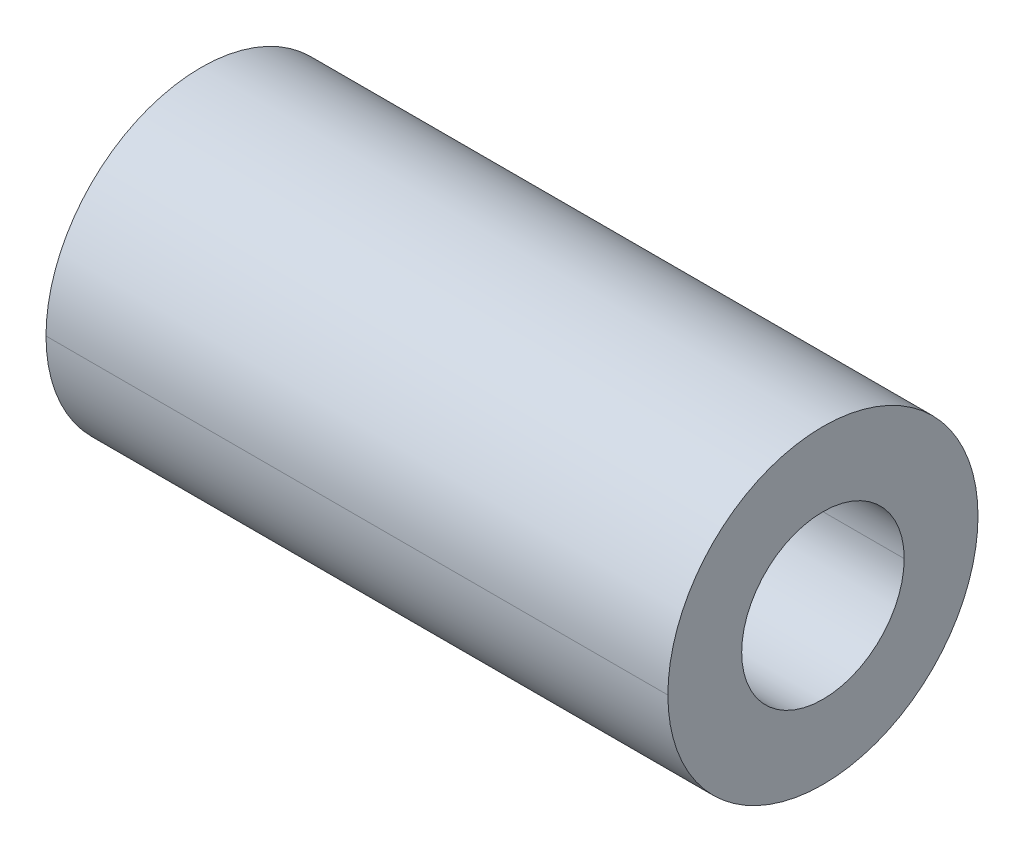
ISO-10303-21;
HEADER;
FILE_DESCRIPTION(('STEP AP214'),'2;1');
FILE_NAME('part.step','',(''),(''),'','','');
FILE_SCHEMA(('AUTOMOTIVE_DESIGN { 1 0 10303 214 1 1 1 1 }'));
ENDSEC;
DATA;
#1=APPLICATION_CONTEXT('core data for automotive mechanical design processes');
#2=APPLICATION_PROTOCOL_DEFINITION('international standard','automotive_design',2000,#1);
#3=PRODUCT_CONTEXT('',#1,'mechanical');
#4=PRODUCT('Part','Part','',(#3));
#5=PRODUCT_RELATED_PRODUCT_CATEGORY('part','',(#4));
#6=PRODUCT_DEFINITION_FORMATION('','',#4);
#7=PRODUCT_DEFINITION_CONTEXT('part definition',#1,'design');
#8=PRODUCT_DEFINITION('design','',#6,#7);
#9=PRODUCT_DEFINITION_SHAPE('','',#8);
#10=(LENGTH_UNIT() NAMED_UNIT(*) SI_UNIT(.MILLI.,.METRE.));
#11=(NAMED_UNIT(*) PLANE_ANGLE_UNIT() SI_UNIT($,.RADIAN.));
#12=(NAMED_UNIT(*) SI_UNIT($,.STERADIAN.) SOLID_ANGLE_UNIT());
#13=UNCERTAINTY_MEASURE_WITH_UNIT(LENGTH_MEASURE(1.E-05),#10,'distance_accuracy_value','');
#14=(GEOMETRIC_REPRESENTATION_CONTEXT(3) GLOBAL_UNCERTAINTY_ASSIGNED_CONTEXT((#13)) GLOBAL_UNIT_ASSIGNED_CONTEXT((#10,
#11,#12)) REPRESENTATION_CONTEXT('',''));
#15=CARTESIAN_POINT('',(0.,0.,0.));
#16=DIRECTION('',(0.,0.,1.));
#17=DIRECTION('',(1.,0.,0.));
#18=AXIS2_PLACEMENT_3D('',#15,#16,#17);
#19=CARTESIAN_POINT('',(9.525,0.,0.));
#20=DIRECTION('',(-1.,0.,0.));
#21=DIRECTION('',(0.,0.,1.));
#22=AXIS2_PLACEMENT_3D('',#19,#20,#21);
#23=CYLINDRICAL_SURFACE('',#22,2.4892);
#24=DIRECTION('',(-1.,0.,0.));
#25=VECTOR('',#24,1.);
#26=CARTESIAN_POINT('',(9.525,0.,-2.4892));
#27=LINE('',#26,#25);
#28=CARTESIAN_POINT('',(9.525,0.,-2.4892));
#29=VERTEX_POINT('',#28);
#30=CARTESIAN_POINT('',(-9.525,0.,-2.4892));
#31=VERTEX_POINT('',#30);
#32=EDGE_CURVE('E75',#29,#31,#27,.T.);
#33=ORIENTED_EDGE('',*,*,#32,.F.);
#34=CARTESIAN_POINT('',(9.525,0.,0.));
#35=DIRECTION('',(1.,0.,0.));
#36=DIRECTION('',(0.,0.,-1.));
#37=AXIS2_PLACEMENT_3D('',#34,#35,#36);
#38=CIRCLE('',#37,2.4892);
#39=CARTESIAN_POINT('',(9.525,0.,2.4892));
#40=VERTEX_POINT('',#39);
#41=EDGE_CURVE('E64',#29,#40,#38,.T.);
#42=ORIENTED_EDGE('',*,*,#41,.T.);
#43=DIRECTION('',(-1.,0.,0.));
#44=VECTOR('',#43,1.);
#45=CARTESIAN_POINT('',(9.525,0.,2.4892));
#46=LINE('',#45,#44);
#47=CARTESIAN_POINT('',(-9.525,0.,2.4892));
#48=VERTEX_POINT('',#47);
#49=EDGE_CURVE('E72',#40,#48,#46,.T.);
#50=ORIENTED_EDGE('',*,*,#49,.T.);
#51=CARTESIAN_POINT('',(-9.525,0.,0.));
#52=DIRECTION('',(1.,0.,0.));
#53=DIRECTION('',(0.,0.,-1.));
#54=AXIS2_PLACEMENT_3D('',#51,#52,#53);
#55=CIRCLE('',#54,2.4892);
#56=EDGE_CURVE('E9',#31,#48,#55,.T.);
#57=ORIENTED_EDGE('',*,*,#56,.F.);
#58=EDGE_LOOP('',(#33,#42,#50,#57));
#59=FACE_BOUND('',#58,.T.);
#60=ADVANCED_FACE('F14',(#59),#23,.F.);
#61=CARTESIAN_POINT('',(9.525,0.,0.));
#62=DIRECTION('',(-1.,0.,0.));
#63=DIRECTION('',(0.,0.,1.));
#64=AXIS2_PLACEMENT_3D('',#61,#62,#63);
#65=CYLINDRICAL_SURFACE('',#64,4.7498);
#66=DIRECTION('',(-1.,0.,0.));
#67=VECTOR('',#66,1.);
#68=CARTESIAN_POINT('',(9.525,0.,-4.7498));
#69=LINE('',#68,#67);
#70=CARTESIAN_POINT('',(9.525,0.,-4.7498));
#71=VERTEX_POINT('',#70);
#72=CARTESIAN_POINT('',(-9.525,0.,-4.7498));
#73=VERTEX_POINT('',#72);
#74=EDGE_CURVE('E18',#71,#73,#69,.T.);
#75=ORIENTED_EDGE('',*,*,#74,.F.);
#76=CARTESIAN_POINT('',(9.525,0.,0.));
#77=DIRECTION('',(1.,0.,0.));
#78=DIRECTION('',(0.,0.,-1.));
#79=AXIS2_PLACEMENT_3D('',#76,#77,#78);
#80=CIRCLE('',#79,4.7498);
#81=CARTESIAN_POINT('',(9.525,0.,4.7498));
#82=VERTEX_POINT('',#81);
#83=EDGE_CURVE('E78',#82,#71,#80,.T.);
#84=ORIENTED_EDGE('',*,*,#83,.F.);
#85=DIRECTION('',(-1.,0.,0.));
#86=VECTOR('',#85,1.);
#87=CARTESIAN_POINT('',(9.525,0.,4.7498));
#88=LINE('',#87,#86);
#89=CARTESIAN_POINT('',(-9.525,0.,4.7498));
#90=VERTEX_POINT('',#89);
#91=EDGE_CURVE('E96',#82,#90,#88,.T.);
#92=ORIENTED_EDGE('',*,*,#91,.T.);
#93=CARTESIAN_POINT('',(-9.525,0.,0.));
#94=DIRECTION('',(1.,0.,0.));
#95=DIRECTION('',(0.,0.,-1.));
#96=AXIS2_PLACEMENT_3D('',#93,#94,#95);
#97=CIRCLE('',#96,4.7498);
#98=EDGE_CURVE('E25',#90,#73,#97,.T.);
#99=ORIENTED_EDGE('',*,*,#98,.T.);
#100=EDGE_LOOP('',(#75,#84,#92,#99));
#101=FACE_BOUND('',#100,.T.);
#102=ADVANCED_FACE('F108',(#101),#65,.T.);
#103=CARTESIAN_POINT('',(-9.525,0.,0.));
#104=DIRECTION('',(1.,0.,0.));
#105=DIRECTION('',(0.,1.,0.));
#106=AXIS2_PLACEMENT_3D('',#103,#104,#105);
#107=PLANE('',#106);
#108=CARTESIAN_POINT('',(-9.525,0.,0.));
#109=DIRECTION('',(1.,0.,0.));
#110=DIRECTION('',(0.,0.,-1.));
#111=AXIS2_PLACEMENT_3D('',#108,#109,#110);
#112=CIRCLE('',#111,2.4892);
#113=EDGE_CURVE('E84',#48,#31,#112,.T.);
#114=ORIENTED_EDGE('',*,*,#113,.T.);
#115=ORIENTED_EDGE('',*,*,#56,.T.);
#116=EDGE_LOOP('',(#114,#115));
#117=FACE_BOUND('',#116,.T.);
#118=ORIENTED_EDGE('',*,*,#98,.F.);
#119=CARTESIAN_POINT('',(-9.525,0.,0.));
#120=DIRECTION('',(1.,0.,0.));
#121=DIRECTION('',(0.,0.,-1.));
#122=AXIS2_PLACEMENT_3D('',#119,#120,#121);
#123=CIRCLE('',#122,4.7498);
#124=EDGE_CURVE('E99',#73,#90,#123,.T.);
#125=ORIENTED_EDGE('',*,*,#124,.F.);
#126=EDGE_LOOP('',(#118,#125));
#127=FACE_BOUND('',#126,.T.);
#128=ADVANCED_FACE('F113',(#117,#127),#107,.F.);
#129=CARTESIAN_POINT('',(9.525,0.,0.));
#130=DIRECTION('',(1.,0.,0.));
#131=DIRECTION('',(0.,1.,0.));
#132=AXIS2_PLACEMENT_3D('',#129,#130,#131);
#133=PLANE('',#132);
#134=CARTESIAN_POINT('',(9.525,0.,0.));
#135=DIRECTION('',(1.,0.,0.));
#136=DIRECTION('',(0.,0.,-1.));
#137=AXIS2_PLACEMENT_3D('',#134,#135,#136);
#138=CIRCLE('',#137,2.4892);
#139=EDGE_CURVE('E82',#40,#29,#138,.T.);
#140=ORIENTED_EDGE('',*,*,#139,.F.);
#141=ORIENTED_EDGE('',*,*,#41,.F.);
#142=EDGE_LOOP('',(#140,#141));
#143=FACE_BOUND('',#142,.T.);
#144=ORIENTED_EDGE('',*,*,#83,.T.);
#145=CARTESIAN_POINT('',(9.525,0.,0.));
#146=DIRECTION('',(1.,0.,0.));
#147=DIRECTION('',(0.,0.,-1.));
#148=AXIS2_PLACEMENT_3D('',#145,#146,#147);
#149=CIRCLE('',#148,4.7498);
#150=EDGE_CURVE('E86',#71,#82,#149,.T.);
#151=ORIENTED_EDGE('',*,*,#150,.T.);
#152=EDGE_LOOP('',(#144,#151));
#153=FACE_BOUND('',#152,.T.);
#154=ADVANCED_FACE('F16',(#143,#153),#133,.T.);
#155=CARTESIAN_POINT('',(9.525,0.,0.));
#156=DIRECTION('',(-1.,0.,0.));
#157=DIRECTION('',(0.,0.,1.));
#158=AXIS2_PLACEMENT_3D('',#155,#156,#157);
#159=CYLINDRICAL_SURFACE('',#158,4.7498);
#160=ORIENTED_EDGE('',*,*,#150,.F.);
#161=ORIENTED_EDGE('',*,*,#74,.T.);
#162=ORIENTED_EDGE('',*,*,#124,.T.);
#163=ORIENTED_EDGE('',*,*,#91,.F.);
#164=EDGE_LOOP('',(#160,#161,#162,#163));
#165=FACE_BOUND('',#164,.T.);
#166=ADVANCED_FACE('F117',(#165),#159,.T.);
#167=CARTESIAN_POINT('',(9.525,0.,0.));
#168=DIRECTION('',(-1.,0.,0.));
#169=DIRECTION('',(0.,0.,1.));
#170=AXIS2_PLACEMENT_3D('',#167,#168,#169);
#171=CYLINDRICAL_SURFACE('',#170,2.4892);
#172=ORIENTED_EDGE('',*,*,#139,.T.);
#173=ORIENTED_EDGE('',*,*,#32,.T.);
#174=ORIENTED_EDGE('',*,*,#113,.F.);
#175=ORIENTED_EDGE('',*,*,#49,.F.);
#176=EDGE_LOOP('',(#172,#173,#174,#175));
#177=FACE_BOUND('',#176,.T.);
#178=ADVANCED_FACE('F81',(#177),#171,.F.);
#179=CLOSED_SHELL('',(#60,#102,#128,#154,#166,#178));
#180=MANIFOLD_SOLID_BREP('B1',#179);
#181=ADVANCED_BREP_SHAPE_REPRESENTATION('',(#18,#180),#14);
#182=SHAPE_DEFINITION_REPRESENTATION(#9,#181);
ENDSEC;
END-ISO-10303-21;
